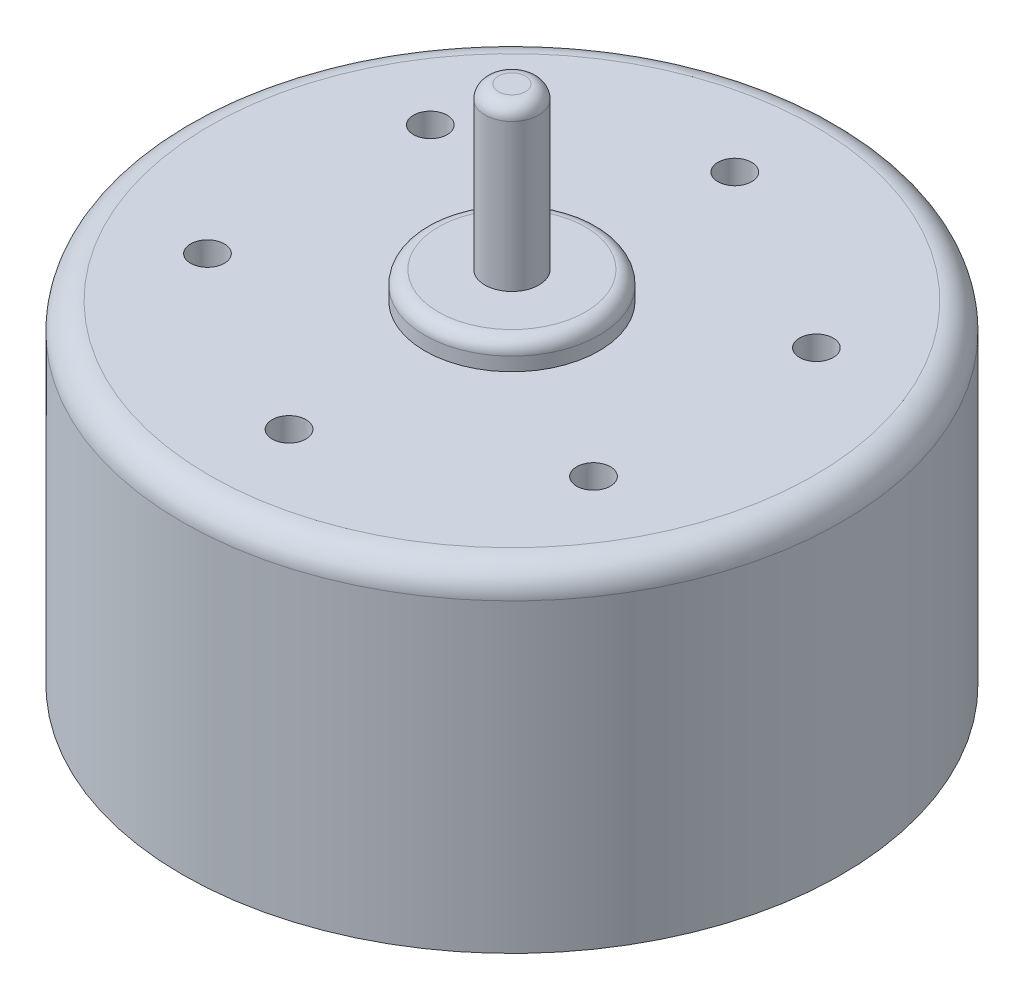
ISO-10303-21;
HEADER;
FILE_DESCRIPTION(('STEP AP214'),'2;1');
FILE_NAME('part.step','',(''),(''),'','','');
FILE_SCHEMA(('AUTOMOTIVE_DESIGN { 1 0 10303 214 1 1 1 1 }'));
ENDSEC;
DATA;
#1=APPLICATION_CONTEXT('core data for automotive mechanical design processes');
#2=APPLICATION_PROTOCOL_DEFINITION('international standard','automotive_design',2000,#1);
#3=PRODUCT_CONTEXT('',#1,'mechanical');
#4=PRODUCT('Part','Part','',(#3));
#5=PRODUCT_RELATED_PRODUCT_CATEGORY('part','',(#4));
#6=PRODUCT_DEFINITION_FORMATION('','',#4);
#7=PRODUCT_DEFINITION_CONTEXT('part definition',#1,'design');
#8=PRODUCT_DEFINITION('design','',#6,#7);
#9=PRODUCT_DEFINITION_SHAPE('','',#8);
#10=(LENGTH_UNIT() NAMED_UNIT(*) SI_UNIT(.MILLI.,.METRE.));
#11=(NAMED_UNIT(*) PLANE_ANGLE_UNIT() SI_UNIT($,.RADIAN.));
#12=(NAMED_UNIT(*) SI_UNIT($,.STERADIAN.) SOLID_ANGLE_UNIT());
#13=UNCERTAINTY_MEASURE_WITH_UNIT(LENGTH_MEASURE(1.E-05),#10,'distance_accuracy_value','');
#14=(GEOMETRIC_REPRESENTATION_CONTEXT(3) GLOBAL_UNCERTAINTY_ASSIGNED_CONTEXT((#13)) GLOBAL_UNIT_ASSIGNED_CONTEXT((#10,
#11,#12)) REPRESENTATION_CONTEXT('',''));
#15=CARTESIAN_POINT('',(0.,0.,0.));
#16=DIRECTION('',(0.,0.,1.));
#17=DIRECTION('',(1.,0.,0.));
#18=AXIS2_PLACEMENT_3D('',#15,#16,#17);
#19=CARTESIAN_POINT('',(0.,13.3,0.));
#20=DIRECTION('',(0.,1.,0.));
#21=DIRECTION('',(0.,0.,1.));
#22=AXIS2_PLACEMENT_3D('',#19,#20,#21);
#23=PLANE('',#22);
#24=CARTESIAN_POINT('',(0.,13.3,0.));
#25=DIRECTION('',(0.,1.,0.));
#26=DIRECTION('',(0.,0.,1.));
#27=AXIS2_PLACEMENT_3D('',#24,#25,#26);
#28=CIRCLE('',#27,2.72500000000001);
#29=CARTESIAN_POINT('',(0.,13.3,2.72500000000001));
#30=VERTEX_POINT('',#29);
#31=EDGE_CURVE('E59',#30,#30,#28,.T.);
#32=ORIENTED_EDGE('',*,*,#31,.T.);
#33=EDGE_LOOP('',(#32));
#34=FACE_BOUND('',#33,.T.);
#35=CARTESIAN_POINT('',(0.,13.3,0.));
#36=DIRECTION('',(0.,1.,0.));
#37=DIRECTION('',(0.,0.,1.));
#38=AXIS2_PLACEMENT_3D('',#35,#36,#37);
#39=CIRCLE('',#38,1.);
#40=CARTESIAN_POINT('',(0.,13.3,1.));
#41=VERTEX_POINT('',#40);
#42=EDGE_CURVE('E140',#41,#41,#39,.T.);
#43=ORIENTED_EDGE('',*,*,#42,.F.);
#44=EDGE_LOOP('',(#43));
#45=FACE_BOUND('',#44,.T.);
#46=ADVANCED_FACE('F50',(#34,#45),#23,.T.);
#47=CARTESIAN_POINT('',(0.,0.,0.));
#48=DIRECTION('',(0.,1.,0.));
#49=DIRECTION('',(0.,0.,1.));
#50=AXIS2_PLACEMENT_3D('',#47,#48,#49);
#51=PLANE('',#50);
#52=CARTESIAN_POINT('',(0.,0.,0.));
#53=DIRECTION('',(0.,-1.,0.));
#54=DIRECTION('',(0.,0.,-1.));
#55=AXIS2_PLACEMENT_3D('',#52,#53,#54);
#56=CIRCLE('',#55,11.7);
#57=CARTESIAN_POINT('',(0.,0.,-11.7));
#58=VERTEX_POINT('',#57);
#59=EDGE_CURVE('E257',#58,#58,#56,.T.);
#60=ORIENTED_EDGE('',*,*,#59,.F.);
#61=EDGE_LOOP('',(#60));
#62=FACE_BOUND('',#61,.T.);
#63=CARTESIAN_POINT('',(0.,0.,0.));
#64=DIRECTION('',(0.,1.,0.));
#65=DIRECTION('',(0.,0.,1.));
#66=AXIS2_PLACEMENT_3D('',#63,#64,#65);
#67=CIRCLE('',#66,12.2);
#68=CARTESIAN_POINT('',(0.,0.,12.2));
#69=VERTEX_POINT('',#68);
#70=EDGE_CURVE('E152',#69,#69,#67,.T.);
#71=ORIENTED_EDGE('',*,*,#70,.F.);
#72=EDGE_LOOP('',(#71));
#73=FACE_BOUND('',#72,.T.);
#74=ADVANCED_FACE('F191',(#62,#73),#51,.F.);
#75=CARTESIAN_POINT('',(0.,12.3,0.));
#76=DIRECTION('',(0.,1.,0.));
#77=DIRECTION('',(0.,0.,1.));
#78=AXIS2_PLACEMENT_3D('',#75,#76,#77);
#79=PLANE('',#78);
#80=CARTESIAN_POINT('',(0.,12.3,8.25));
#81=DIRECTION('',(0.,1.,0.));
#82=DIRECTION('',(0.,0.,1.));
#83=AXIS2_PLACEMENT_3D('',#80,#81,#82);
#84=CIRCLE('',#83,0.62499999999999);
#85=CARTESIAN_POINT('',(0.,12.3,8.87499999999999));
#86=VERTEX_POINT('',#85);
#87=EDGE_CURVE('E94',#86,#86,#84,.T.);
#88=ORIENTED_EDGE('',*,*,#87,.F.);
#89=EDGE_LOOP('',(#88));
#90=FACE_BOUND('',#89,.T.);
#91=CARTESIAN_POINT('',(-7.14470958122163,12.3,4.12499999999998));
#92=DIRECTION('',(0.,1.,0.));
#93=DIRECTION('',(0.,0.,1.));
#94=AXIS2_PLACEMENT_3D('',#91,#92,#93);
#95=CIRCLE('',#94,0.62499999999999);
#96=CARTESIAN_POINT('',(-7.14470958122163,12.3,4.74999999999997));
#97=VERTEX_POINT('',#96);
#98=EDGE_CURVE('E93',#97,#97,#95,.T.);
#99=ORIENTED_EDGE('',*,*,#98,.F.);
#100=EDGE_LOOP('',(#99));
#101=FACE_BOUND('',#100,.T.);
#102=CARTESIAN_POINT('',(-7.1447095812216,12.3,-4.12500000000003));
#103=DIRECTION('',(0.,1.,0.));
#104=DIRECTION('',(0.,0.,1.));
#105=AXIS2_PLACEMENT_3D('',#102,#103,#104);
#106=CIRCLE('',#105,0.62499999999999);
#107=CARTESIAN_POINT('',(-7.1447095812216,12.3,-3.50000000000004));
#108=VERTEX_POINT('',#107);
#109=EDGE_CURVE('E108',#108,#108,#106,.T.);
#110=ORIENTED_EDGE('',*,*,#109,.F.);
#111=EDGE_LOOP('',(#110));
#112=FACE_BOUND('',#111,.T.);
#113=CARTESIAN_POINT('',(0.,12.3,-8.25));
#114=DIRECTION('',(0.,1.,0.));
#115=DIRECTION('',(0.,0.,1.));
#116=AXIS2_PLACEMENT_3D('',#113,#114,#115);
#117=CIRCLE('',#116,0.62499999999999);
#118=CARTESIAN_POINT('',(0.,12.3,-7.62500000000001));
#119=VERTEX_POINT('',#118);
#120=EDGE_CURVE('E116',#119,#119,#117,.T.);
#121=ORIENTED_EDGE('',*,*,#120,.F.);
#122=EDGE_LOOP('',(#121));
#123=FACE_BOUND('',#122,.T.);
#124=CARTESIAN_POINT('',(7.14470958122166,12.3,-4.12499999999993));
#125=DIRECTION('',(0.,1.,0.));
#126=DIRECTION('',(0.,0.,1.));
#127=AXIS2_PLACEMENT_3D('',#124,#125,#126);
#128=CIRCLE('',#127,0.62499999999999);
#129=CARTESIAN_POINT('',(7.14470958122166,12.3,-3.49999999999994));
#130=VERTEX_POINT('',#129);
#131=EDGE_CURVE('E124',#130,#130,#128,.T.);
#132=ORIENTED_EDGE('',*,*,#131,.F.);
#133=EDGE_LOOP('',(#132));
#134=FACE_BOUND('',#133,.T.);
#135=CARTESIAN_POINT('',(7.14470958122157,12.3,4.12500000000008));
#136=DIRECTION('',(0.,1.,0.));
#137=DIRECTION('',(0.,0.,1.));
#138=AXIS2_PLACEMENT_3D('',#135,#136,#137);
#139=CIRCLE('',#138,0.62499999999999);
#140=CARTESIAN_POINT('',(7.14470958122157,12.3,4.75000000000007));
#141=VERTEX_POINT('',#140);
#142=EDGE_CURVE('E132',#141,#141,#139,.T.);
#143=ORIENTED_EDGE('',*,*,#142,.F.);
#144=EDGE_LOOP('',(#143));
#145=FACE_BOUND('',#144,.T.);
#146=CARTESIAN_POINT('',(0.,12.3,0.));
#147=DIRECTION('',(0.,1.,0.));
#148=DIRECTION('',(0.,0.,1.));
#149=AXIS2_PLACEMENT_3D('',#146,#147,#148);
#150=CIRCLE('',#149,11.2);
#151=CARTESIAN_POINT('',(0.,12.3,11.2));
#152=VERTEX_POINT('',#151);
#153=EDGE_CURVE('E156',#152,#152,#150,.T.);
#154=ORIENTED_EDGE('',*,*,#153,.T.);
#155=EDGE_LOOP('',(#154));
#156=FACE_BOUND('',#155,.T.);
#157=CARTESIAN_POINT('',(0.,12.3,0.));
#158=DIRECTION('',(0.,1.,0.));
#159=DIRECTION('',(0.,0.,1.));
#160=AXIS2_PLACEMENT_3D('',#157,#158,#159);
#161=CIRCLE('',#160,3.22500000000001);
#162=CARTESIAN_POINT('',(0.,12.3,3.22500000000001));
#163=VERTEX_POINT('',#162);
#164=EDGE_CURVE('E148',#163,#163,#161,.T.);
#165=ORIENTED_EDGE('',*,*,#164,.F.);
#166=EDGE_LOOP('',(#165));
#167=FACE_BOUND('',#166,.T.);
#168=ADVANCED_FACE('F196',(#90,#101,#112,#123,#134,#145,#156,#167),#79,.T.);
#169=CARTESIAN_POINT('',(0.,12.3,0.));
#170=DIRECTION('',(0.,-1.,0.));
#171=DIRECTION('',(0.,0.,-1.));
#172=AXIS2_PLACEMENT_3D('',#169,#170,#171);
#173=CYLINDRICAL_SURFACE('',#172,12.2);
#174=CARTESIAN_POINT('',(0.,11.3,0.));
#175=DIRECTION('',(0.,1.,0.));
#176=DIRECTION('',(0.,0.,1.));
#177=AXIS2_PLACEMENT_3D('',#174,#175,#176);
#178=CIRCLE('',#177,12.2);
#179=CARTESIAN_POINT('',(0.,11.3,12.2));
#180=VERTEX_POINT('',#179);
#181=EDGE_CURVE('E160',#180,#180,#178,.F.);
#182=ORIENTED_EDGE('',*,*,#181,.T.);
#183=EDGE_LOOP('',(#182));
#184=FACE_BOUND('',#183,.T.);
#185=ORIENTED_EDGE('',*,*,#70,.T.);
#186=EDGE_LOOP('',(#185));
#187=FACE_BOUND('',#186,.T.);
#188=ADVANCED_FACE('F207',(#184,#187),#173,.T.);
#189=CARTESIAN_POINT('',(0.,13.3,0.));
#190=DIRECTION('',(0.,-1.,0.));
#191=DIRECTION('',(0.,0.,-1.));
#192=AXIS2_PLACEMENT_3D('',#189,#190,#191);
#193=CYLINDRICAL_SURFACE('',#192,3.22500000000001);
#194=CARTESIAN_POINT('',(0.,12.8,0.));
#195=DIRECTION('',(0.,1.,0.));
#196=DIRECTION('',(0.,0.,1.));
#197=AXIS2_PLACEMENT_3D('',#194,#195,#196);
#198=CIRCLE('',#197,3.22500000000001);
#199=CARTESIAN_POINT('',(0.,12.8,3.22500000000001));
#200=VERTEX_POINT('',#199);
#201=EDGE_CURVE('E13',#200,#200,#198,.F.);
#202=ORIENTED_EDGE('',*,*,#201,.T.);
#203=EDGE_LOOP('',(#202));
#204=FACE_BOUND('',#203,.T.);
#205=ORIENTED_EDGE('',*,*,#164,.T.);
#206=EDGE_LOOP('',(#205));
#207=FACE_BOUND('',#206,.T.);
#208=ADVANCED_FACE('F203',(#204,#207),#193,.T.);
#209=CARTESIAN_POINT('',(0.,19.25,0.));
#210=DIRECTION('',(0.,-1.,0.));
#211=DIRECTION('',(0.,0.,-1.));
#212=AXIS2_PLACEMENT_3D('',#209,#210,#211);
#213=CYLINDRICAL_SURFACE('',#212,1.);
#214=CARTESIAN_POINT('',(0.,18.75,0.));
#215=DIRECTION('',(0.,1.,0.));
#216=DIRECTION('',(0.,0.,1.));
#217=AXIS2_PLACEMENT_3D('',#214,#215,#216);
#218=CIRCLE('',#217,1.);
#219=CARTESIAN_POINT('',(0.,18.75,1.));
#220=VERTEX_POINT('',#219);
#221=EDGE_CURVE('E168',#220,#220,#218,.F.);
#222=ORIENTED_EDGE('',*,*,#221,.T.);
#223=EDGE_LOOP('',(#222));
#224=FACE_BOUND('',#223,.T.);
#225=ORIENTED_EDGE('',*,*,#42,.T.);
#226=EDGE_LOOP('',(#225));
#227=FACE_BOUND('',#226,.T.);
#228=ADVANCED_FACE('F206',(#224,#227),#213,.T.);
#229=CARTESIAN_POINT('',(0.,19.25,0.));
#230=DIRECTION('',(0.,1.,0.));
#231=DIRECTION('',(0.,0.,1.));
#232=AXIS2_PLACEMENT_3D('',#229,#230,#231);
#233=PLANE('',#232);
#234=CARTESIAN_POINT('',(0.,19.25,0.));
#235=DIRECTION('',(0.,1.,0.));
#236=DIRECTION('',(0.,0.,1.));
#237=AXIS2_PLACEMENT_3D('',#234,#235,#236);
#238=CIRCLE('',#237,0.5);
#239=CARTESIAN_POINT('',(0.,19.25,0.5));
#240=VERTEX_POINT('',#239);
#241=EDGE_CURVE('E164',#240,#240,#238,.T.);
#242=ORIENTED_EDGE('',*,*,#241,.T.);
#243=EDGE_LOOP('',(#242));
#244=FACE_BOUND('',#243,.T.);
#245=ADVANCED_FACE('F216',(#244),#233,.T.);
#246=CARTESIAN_POINT('',(0.,11.3,0.));
#247=DIRECTION('',(0.,1.,0.));
#248=DIRECTION('',(0.,0.,1.));
#249=AXIS2_PLACEMENT_3D('',#246,#247,#248);
#250=TOROIDAL_SURFACE('',#249,11.2,1.);
#251=ORIENTED_EDGE('',*,*,#181,.F.);
#252=EDGE_LOOP('',(#251));
#253=FACE_BOUND('',#252,.T.);
#254=ORIENTED_EDGE('',*,*,#153,.F.);
#255=EDGE_LOOP('',(#254));
#256=FACE_BOUND('',#255,.T.);
#257=ADVANCED_FACE('F187',(#253,#256),#250,.T.);
#258=CARTESIAN_POINT('',(0.,18.75,0.));
#259=DIRECTION('',(0.,1.,0.));
#260=DIRECTION('',(0.,0.,1.));
#261=AXIS2_PLACEMENT_3D('',#258,#259,#260);
#262=DEGENERATE_TOROIDAL_SURFACE('',#261,0.5,0.5,.T.);
#263=ORIENTED_EDGE('',*,*,#221,.F.);
#264=EDGE_LOOP('',(#263));
#265=FACE_BOUND('',#264,.T.);
#266=ORIENTED_EDGE('',*,*,#241,.F.);
#267=EDGE_LOOP('',(#266));
#268=FACE_BOUND('',#267,.T.);
#269=ADVANCED_FACE('F179',(#265,#268),#262,.T.);
#270=CARTESIAN_POINT('',(0.,12.8,0.));
#271=DIRECTION('',(0.,1.,0.));
#272=DIRECTION('',(0.,0.,1.));
#273=AXIS2_PLACEMENT_3D('',#270,#271,#272);
#274=TOROIDAL_SURFACE('',#273,2.72500000000001,0.5);
#275=ORIENTED_EDGE('',*,*,#201,.F.);
#276=EDGE_LOOP('',(#275));
#277=FACE_BOUND('',#276,.T.);
#278=ORIENTED_EDGE('',*,*,#31,.F.);
#279=EDGE_LOOP('',(#278));
#280=FACE_BOUND('',#279,.T.);
#281=ADVANCED_FACE('F52',(#277,#280),#274,.T.);
#282=CARTESIAN_POINT('',(7.14470958122157,11.2,4.12500000000008));
#283=DIRECTION('',(0.,1.,0.));
#284=DIRECTION('',(0.,0.,1.));
#285=AXIS2_PLACEMENT_3D('',#282,#283,#284);
#286=CONICAL_SURFACE('',#285,0.624999999999999,1.02974425867665);
#287=CARTESIAN_POINT('',(7.14470958122157,10.8244621131078,4.12500000000008));
#288=VERTEX_POINT('',#287);
#289=VERTEX_LOOP('',#288);
#290=FACE_BOUND('',#289,.T.);
#291=CARTESIAN_POINT('',(7.14470958122157,11.2,4.12500000000008));
#292=DIRECTION('',(0.,1.,0.));
#293=DIRECTION('',(0.,0.,1.));
#294=AXIS2_PLACEMENT_3D('',#291,#292,#293);
#295=CIRCLE('',#294,0.624999999999999);
#296=CARTESIAN_POINT('',(7.14470958122157,11.2,4.75000000000008));
#297=VERTEX_POINT('',#296);
#298=EDGE_CURVE('E136',#297,#297,#295,.T.);
#299=ORIENTED_EDGE('',*,*,#298,.T.);
#300=EDGE_LOOP('',(#299));
#301=FACE_BOUND('',#300,.T.);
#302=ADVANCED_FACE('F178',(#290,#301),#286,.F.);
#303=CARTESIAN_POINT('',(7.14470958122157,12.3,4.12500000000008));
#304=DIRECTION('',(0.,1.,0.));
#305=DIRECTION('',(0.,0.,1.));
#306=AXIS2_PLACEMENT_3D('',#303,#304,#305);
#307=CYLINDRICAL_SURFACE('',#306,0.624999999999994);
#308=ORIENTED_EDGE('',*,*,#298,.F.);
#309=EDGE_LOOP('',(#308));
#310=FACE_BOUND('',#309,.T.);
#311=ORIENTED_EDGE('',*,*,#142,.T.);
#312=EDGE_LOOP('',(#311));
#313=FACE_BOUND('',#312,.T.);
#314=ADVANCED_FACE('F185',(#310,#313),#307,.F.);
#315=CARTESIAN_POINT('',(7.14470958122166,11.2,-4.12499999999993));
#316=DIRECTION('',(0.,1.,0.));
#317=DIRECTION('',(0.,0.,1.));
#318=AXIS2_PLACEMENT_3D('',#315,#316,#317);
#319=CONICAL_SURFACE('',#318,0.624999999999999,1.02974425867665);
#320=CARTESIAN_POINT('',(7.14470958122166,10.8244621131078,-4.12499999999993));
#321=VERTEX_POINT('',#320);
#322=VERTEX_LOOP('',#321);
#323=FACE_BOUND('',#322,.T.);
#324=CARTESIAN_POINT('',(7.14470958122166,11.2,-4.12499999999993));
#325=DIRECTION('',(0.,1.,0.));
#326=DIRECTION('',(0.,0.,1.));
#327=AXIS2_PLACEMENT_3D('',#324,#325,#326);
#328=CIRCLE('',#327,0.624999999999999);
#329=CARTESIAN_POINT('',(7.14470958122166,11.2,-3.49999999999993));
#330=VERTEX_POINT('',#329);
#331=EDGE_CURVE('E128',#330,#330,#328,.T.);
#332=ORIENTED_EDGE('',*,*,#331,.T.);
#333=EDGE_LOOP('',(#332));
#334=FACE_BOUND('',#333,.T.);
#335=ADVANCED_FACE('F302',(#323,#334),#319,.F.);
#336=CARTESIAN_POINT('',(7.14470958122166,12.3,-4.12499999999993));
#337=DIRECTION('',(0.,1.,0.));
#338=DIRECTION('',(0.,0.,1.));
#339=AXIS2_PLACEMENT_3D('',#336,#337,#338);
#340=CYLINDRICAL_SURFACE('',#339,0.624999999999994);
#341=ORIENTED_EDGE('',*,*,#331,.F.);
#342=EDGE_LOOP('',(#341));
#343=FACE_BOUND('',#342,.T.);
#344=ORIENTED_EDGE('',*,*,#131,.T.);
#345=EDGE_LOOP('',(#344));
#346=FACE_BOUND('',#345,.T.);
#347=ADVANCED_FACE('F298',(#343,#346),#340,.F.);
#348=CARTESIAN_POINT('',(0.,11.2,-8.25));
#349=DIRECTION('',(0.,1.,0.));
#350=DIRECTION('',(0.,0.,1.));
#351=AXIS2_PLACEMENT_3D('',#348,#349,#350);
#352=CONICAL_SURFACE('',#351,0.624999999999999,1.02974425867665);
#353=CARTESIAN_POINT('',(0.,10.8244621131078,-8.25));
#354=VERTEX_POINT('',#353);
#355=VERTEX_LOOP('',#354);
#356=FACE_BOUND('',#355,.T.);
#357=CARTESIAN_POINT('',(0.,11.2,-8.25));
#358=DIRECTION('',(0.,1.,0.));
#359=DIRECTION('',(0.,0.,1.));
#360=AXIS2_PLACEMENT_3D('',#357,#358,#359);
#361=CIRCLE('',#360,0.624999999999999);
#362=CARTESIAN_POINT('',(0.,11.2,-7.625));
#363=VERTEX_POINT('',#362);
#364=EDGE_CURVE('E120',#363,#363,#361,.T.);
#365=ORIENTED_EDGE('',*,*,#364,.T.);
#366=EDGE_LOOP('',(#365));
#367=FACE_BOUND('',#366,.T.);
#368=ADVANCED_FACE('F294',(#356,#367),#352,.F.);
#369=CARTESIAN_POINT('',(0.,12.3,-8.25));
#370=DIRECTION('',(0.,1.,0.));
#371=DIRECTION('',(0.,0.,1.));
#372=AXIS2_PLACEMENT_3D('',#369,#370,#371);
#373=CYLINDRICAL_SURFACE('',#372,0.624999999999995);
#374=ORIENTED_EDGE('',*,*,#364,.F.);
#375=EDGE_LOOP('',(#374));
#376=FACE_BOUND('',#375,.T.);
#377=ORIENTED_EDGE('',*,*,#120,.T.);
#378=EDGE_LOOP('',(#377));
#379=FACE_BOUND('',#378,.T.);
#380=ADVANCED_FACE('F290',(#376,#379),#373,.F.);
#381=CARTESIAN_POINT('',(-7.1447095812216,11.2,-4.12500000000003));
#382=DIRECTION('',(0.,1.,0.));
#383=DIRECTION('',(0.,0.,1.));
#384=AXIS2_PLACEMENT_3D('',#381,#382,#383);
#385=CONICAL_SURFACE('',#384,0.624999999999999,1.02974425867665);
#386=CARTESIAN_POINT('',(-7.1447095812216,10.8244621131078,-4.12500000000003));
#387=VERTEX_POINT('',#386);
#388=VERTEX_LOOP('',#387);
#389=FACE_BOUND('',#388,.T.);
#390=CARTESIAN_POINT('',(-7.1447095812216,11.2,-4.12500000000003));
#391=DIRECTION('',(0.,1.,0.));
#392=DIRECTION('',(0.,0.,1.));
#393=AXIS2_PLACEMENT_3D('',#390,#391,#392);
#394=CIRCLE('',#393,0.624999999999999);
#395=CARTESIAN_POINT('',(-7.1447095812216,11.2,-3.50000000000003));
#396=VERTEX_POINT('',#395);
#397=EDGE_CURVE('E112',#396,#396,#394,.T.);
#398=ORIENTED_EDGE('',*,*,#397,.T.);
#399=EDGE_LOOP('',(#398));
#400=FACE_BOUND('',#399,.T.);
#401=ADVANCED_FACE('F286',(#389,#400),#385,.F.);
#402=CARTESIAN_POINT('',(-7.1447095812216,12.3,-4.12500000000003));
#403=DIRECTION('',(0.,1.,0.));
#404=DIRECTION('',(0.,0.,1.));
#405=AXIS2_PLACEMENT_3D('',#402,#403,#404);
#406=CYLINDRICAL_SURFACE('',#405,0.624999999999994);
#407=ORIENTED_EDGE('',*,*,#397,.F.);
#408=EDGE_LOOP('',(#407));
#409=FACE_BOUND('',#408,.T.);
#410=ORIENTED_EDGE('',*,*,#109,.T.);
#411=EDGE_LOOP('',(#410));
#412=FACE_BOUND('',#411,.T.);
#413=ADVANCED_FACE('F282',(#409,#412),#406,.F.);
#414=CARTESIAN_POINT('',(-7.14470958122163,11.2,4.12499999999998));
#415=DIRECTION('',(0.,1.,0.));
#416=DIRECTION('',(0.,0.,1.));
#417=AXIS2_PLACEMENT_3D('',#414,#415,#416);
#418=CONICAL_SURFACE('',#417,0.624999999999999,1.02974425867665);
#419=CARTESIAN_POINT('',(-7.14470958122163,10.8244621131078,4.12499999999998));
#420=VERTEX_POINT('',#419);
#421=VERTEX_LOOP('',#420);
#422=FACE_BOUND('',#421,.T.);
#423=CARTESIAN_POINT('',(-7.14470958122163,11.2,4.12499999999998));
#424=DIRECTION('',(0.,1.,0.));
#425=DIRECTION('',(0.,0.,1.));
#426=AXIS2_PLACEMENT_3D('',#423,#424,#425);
#427=CIRCLE('',#426,0.624999999999999);
#428=CARTESIAN_POINT('',(-7.14470958122163,11.2,4.74999999999998));
#429=VERTEX_POINT('',#428);
#430=EDGE_CURVE('E98',#429,#429,#427,.T.);
#431=ORIENTED_EDGE('',*,*,#430,.T.);
#432=EDGE_LOOP('',(#431));
#433=FACE_BOUND('',#432,.T.);
#434=ADVANCED_FACE('F278',(#422,#433),#418,.F.);
#435=CARTESIAN_POINT('',(-7.14470958122163,12.3,4.12499999999998));
#436=DIRECTION('',(0.,1.,0.));
#437=DIRECTION('',(0.,0.,1.));
#438=AXIS2_PLACEMENT_3D('',#435,#436,#437);
#439=CYLINDRICAL_SURFACE('',#438,0.624999999999994);
#440=ORIENTED_EDGE('',*,*,#430,.F.);
#441=EDGE_LOOP('',(#440));
#442=FACE_BOUND('',#441,.T.);
#443=ORIENTED_EDGE('',*,*,#98,.T.);
#444=EDGE_LOOP('',(#443));
#445=FACE_BOUND('',#444,.T.);
#446=ADVANCED_FACE('F87',(#442,#445),#439,.F.);
#447=CARTESIAN_POINT('',(0.,11.2,8.25));
#448=DIRECTION('',(0.,1.,0.));
#449=DIRECTION('',(0.,0.,1.));
#450=AXIS2_PLACEMENT_3D('',#447,#448,#449);
#451=CONICAL_SURFACE('',#450,0.624999999999999,1.02974425867665);
#452=CARTESIAN_POINT('',(0.,10.8244621131078,8.25));
#453=VERTEX_POINT('',#452);
#454=VERTEX_LOOP('',#453);
#455=FACE_BOUND('',#454,.T.);
#456=CARTESIAN_POINT('',(0.,11.2,8.25));
#457=DIRECTION('',(0.,1.,0.));
#458=DIRECTION('',(0.,0.,1.));
#459=AXIS2_PLACEMENT_3D('',#456,#457,#458);
#460=CIRCLE('',#459,0.624999999999999);
#461=CARTESIAN_POINT('',(0.,11.2,8.875));
#462=VERTEX_POINT('',#461);
#463=EDGE_CURVE('E91',#462,#462,#460,.T.);
#464=ORIENTED_EDGE('',*,*,#463,.T.);
#465=EDGE_LOOP('',(#464));
#466=FACE_BOUND('',#465,.T.);
#467=ADVANCED_FACE('F83',(#455,#466),#451,.F.);
#468=CARTESIAN_POINT('',(0.,12.3,8.25));
#469=DIRECTION('',(0.,1.,0.));
#470=DIRECTION('',(0.,0.,1.));
#471=AXIS2_PLACEMENT_3D('',#468,#469,#470);
#472=CYLINDRICAL_SURFACE('',#471,0.624999999999995);
#473=ORIENTED_EDGE('',*,*,#463,.F.);
#474=EDGE_LOOP('',(#473));
#475=FACE_BOUND('',#474,.T.);
#476=ORIENTED_EDGE('',*,*,#87,.T.);
#477=EDGE_LOOP('',(#476));
#478=FACE_BOUND('',#477,.T.);
#479=ADVANCED_FACE('F86',(#475,#478),#472,.F.);
#480=CARTESIAN_POINT('',(0.,0.5,0.));
#481=DIRECTION('',(0.,-1.,0.));
#482=DIRECTION('',(0.,0.,-1.));
#483=AXIS2_PLACEMENT_3D('',#480,#481,#482);
#484=CYLINDRICAL_SURFACE('',#483,11.7);
#485=CARTESIAN_POINT('',(0.,0.5,0.));
#486=DIRECTION('',(0.,-1.,0.));
#487=DIRECTION('',(0.,0.,-1.));
#488=AXIS2_PLACEMENT_3D('',#485,#486,#487);
#489=CIRCLE('',#488,11.7);
#490=CARTESIAN_POINT('',(0.,0.5,-11.7));
#491=VERTEX_POINT('',#490);
#492=EDGE_CURVE('E101',#491,#491,#489,.T.);
#493=ORIENTED_EDGE('',*,*,#492,.F.);
#494=EDGE_LOOP('',(#493));
#495=FACE_BOUND('',#494,.T.);
#496=ORIENTED_EDGE('',*,*,#59,.T.);
#497=EDGE_LOOP('',(#496));
#498=FACE_BOUND('',#497,.T.);
#499=ADVANCED_FACE('F248',(#495,#498),#484,.F.);
#500=CARTESIAN_POINT('',(0.,0.5,0.));
#501=DIRECTION('',(0.,-1.,0.));
#502=DIRECTION('',(0.,0.,-1.));
#503=AXIS2_PLACEMENT_3D('',#500,#501,#502);
#504=PLANE('',#503);
#505=CARTESIAN_POINT('',(0.,0.5,0.));
#506=DIRECTION('',(0.,-1.,0.));
#507=DIRECTION('',(0.,0.,-1.));
#508=AXIS2_PLACEMENT_3D('',#505,#506,#507);
#509=CIRCLE('',#508,3.05);
#510=CARTESIAN_POINT('',(0.,0.5,-3.05));
#511=VERTEX_POINT('',#510);
#512=EDGE_CURVE('E255',#511,#511,#509,.T.);
#513=ORIENTED_EDGE('',*,*,#512,.F.);
#514=EDGE_LOOP('',(#513));
#515=FACE_BOUND('',#514,.T.);
#516=ORIENTED_EDGE('',*,*,#492,.T.);
#517=EDGE_LOOP('',(#516));
#518=FACE_BOUND('',#517,.T.);
#519=ADVANCED_FACE('F241',(#515,#518),#504,.T.);
#520=CARTESIAN_POINT('',(0.,-0.5,0.));
#521=DIRECTION('',(0.,-1.,0.));
#522=DIRECTION('',(0.,0.,-1.));
#523=AXIS2_PLACEMENT_3D('',#520,#521,#522);
#524=PLANE('',#523);
#525=CARTESIAN_POINT('',(0.,-0.5,0.));
#526=DIRECTION('',(0.,-1.,0.));
#527=DIRECTION('',(0.,0.,-1.));
#528=AXIS2_PLACEMENT_3D('',#525,#526,#527);
#529=CIRCLE('',#528,3.05);
#530=CARTESIAN_POINT('',(0.,-0.5,-3.05));
#531=VERTEX_POINT('',#530);
#532=EDGE_CURVE('E144',#531,#531,#529,.T.);
#533=ORIENTED_EDGE('',*,*,#532,.T.);
#534=EDGE_LOOP('',(#533));
#535=FACE_BOUND('',#534,.T.);
#536=ADVANCED_FACE('F239',(#535),#524,.T.);
#537=CARTESIAN_POINT('',(0.,-0.5,0.));
#538=DIRECTION('',(0.,1.,0.));
#539=DIRECTION('',(0.,0.,1.));
#540=AXIS2_PLACEMENT_3D('',#537,#538,#539);
#541=CYLINDRICAL_SURFACE('',#540,3.05);
#542=ORIENTED_EDGE('',*,*,#532,.F.);
#543=EDGE_LOOP('',(#542));
#544=FACE_BOUND('',#543,.T.);
#545=ORIENTED_EDGE('',*,*,#512,.T.);
#546=EDGE_LOOP('',(#545));
#547=FACE_BOUND('',#546,.T.);
#548=ADVANCED_FACE('F201',(#544,#547),#541,.T.);
#549=CLOSED_SHELL('',(#46,#74,#168,#188,#208,#228,#245,#257,#269,#281,#302,#314,#335,#347,#368,
#380,#401,#413,#434,#446,#467,#479,#499,#519,#536,#548));
#550=MANIFOLD_SOLID_BREP('B2',#549);
#551=ADVANCED_BREP_SHAPE_REPRESENTATION('',(#18,#550),#14);
#552=SHAPE_DEFINITION_REPRESENTATION(#9,#551);
ENDSEC;
END-ISO-10303-21;
